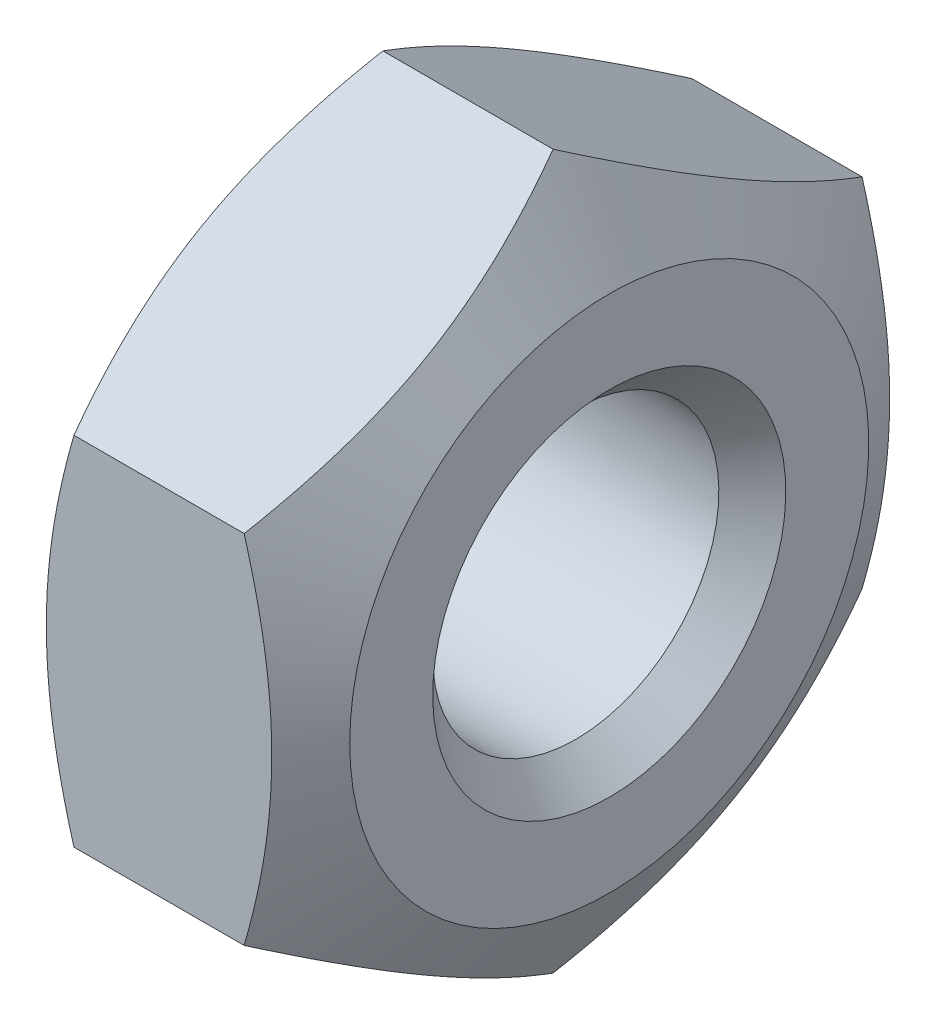
ISO-10303-21;
HEADER;
FILE_DESCRIPTION(('STEP AP214'),'2;1');
FILE_NAME('part.step','',(''),(''),'','','');
FILE_SCHEMA(('AUTOMOTIVE_DESIGN { 1 0 10303 214 1 1 1 1 }'));
ENDSEC;
DATA;
#1=APPLICATION_CONTEXT('core data for automotive mechanical design processes');
#2=APPLICATION_PROTOCOL_DEFINITION('international standard','automotive_design',2000,#1);
#3=PRODUCT_CONTEXT('',#1,'mechanical');
#4=PRODUCT('Part','Part','',(#3));
#5=PRODUCT_RELATED_PRODUCT_CATEGORY('part','',(#4));
#6=PRODUCT_DEFINITION_FORMATION('','',#4);
#7=PRODUCT_DEFINITION_CONTEXT('part definition',#1,'design');
#8=PRODUCT_DEFINITION('design','',#6,#7);
#9=PRODUCT_DEFINITION_SHAPE('','',#8);
#10=(LENGTH_UNIT() NAMED_UNIT(*) SI_UNIT(.MILLI.,.METRE.));
#11=(NAMED_UNIT(*) PLANE_ANGLE_UNIT() SI_UNIT($,.RADIAN.));
#12=(NAMED_UNIT(*) SI_UNIT($,.STERADIAN.) SOLID_ANGLE_UNIT());
#13=UNCERTAINTY_MEASURE_WITH_UNIT(LENGTH_MEASURE(1.E-05),#10,'distance_accuracy_value','');
#14=(GEOMETRIC_REPRESENTATION_CONTEXT(3) GLOBAL_UNCERTAINTY_ASSIGNED_CONTEXT((#13)) GLOBAL_UNIT_ASSIGNED_CONTEXT((#10,
#11,#12)) REPRESENTATION_CONTEXT('',''));
#15=CARTESIAN_POINT('',(0.,0.,0.));
#16=DIRECTION('',(0.,0.,1.));
#17=DIRECTION('',(1.,0.,0.));
#18=AXIS2_PLACEMENT_3D('',#15,#16,#17);
#19=CARTESIAN_POINT('',(1.6,0.,0.));
#20=DIRECTION('',(1.,0.,0.));
#21=DIRECTION('',(0.,0.,-1.));
#22=AXIS2_PLACEMENT_3D('',#19,#20,#21);
#23=PLANE('',#22);
#24=CARTESIAN_POINT('',(1.6,0.,0.));
#25=DIRECTION('',(-1.,0.,0.));
#26=DIRECTION('',(0.,-1.,0.));
#27=AXIS2_PLACEMENT_3D('',#24,#25,#26);
#28=CIRCLE('',#27,2.);
#29=CARTESIAN_POINT('',(1.60000000000001,-2.,0.));
#30=VERTEX_POINT('',#29);
#31=EDGE_CURVE('E209',#30,#30,#28,.T.);
#32=ORIENTED_EDGE('',*,*,#31,.T.);
#33=EDGE_LOOP('',(#32));
#34=FACE_BOUND('',#33,.T.);
#35=CARTESIAN_POINT('',(1.6,0.,0.));
#36=DIRECTION('',(-1.,0.,0.));
#37=DIRECTION('',(0.,0.,1.));
#38=AXIS2_PLACEMENT_3D('',#35,#36,#37);
#39=CIRCLE('',#38,2.94);
#40=CARTESIAN_POINT('',(1.6,0.,2.94));
#41=VERTEX_POINT('',#40);
#42=EDGE_CURVE('E229',#41,#41,#39,.T.);
#43=ORIENTED_EDGE('',*,*,#42,.F.);
#44=EDGE_LOOP('',(#43));
#45=FACE_BOUND('',#44,.T.);
#46=ADVANCED_FACE('F37',(#34,#45),#23,.T.);
#47=CARTESIAN_POINT('',(-1.6,0.,0.));
#48=DIRECTION('',(1.,0.,0.));
#49=DIRECTION('',(0.,0.,-1.));
#50=AXIS2_PLACEMENT_3D('',#47,#48,#49);
#51=PLANE('',#50);
#52=CARTESIAN_POINT('',(-1.6,0.,0.));
#53=DIRECTION('',(-1.,0.,0.));
#54=DIRECTION('',(0.,-1.,0.));
#55=AXIS2_PLACEMENT_3D('',#52,#53,#54);
#56=CIRCLE('',#55,2.00000000000001);
#57=CARTESIAN_POINT('',(-1.59999999999999,-2.00000000000001,0.));
#58=VERTEX_POINT('',#57);
#59=EDGE_CURVE('E114',#58,#58,#56,.T.);
#60=ORIENTED_EDGE('',*,*,#59,.F.);
#61=EDGE_LOOP('',(#60));
#62=FACE_BOUND('',#61,.T.);
#63=CARTESIAN_POINT('',(-1.6,0.,0.));
#64=DIRECTION('',(-1.,0.,0.));
#65=DIRECTION('',(0.,0.,1.));
#66=AXIS2_PLACEMENT_3D('',#63,#64,#65);
#67=CIRCLE('',#66,2.94);
#68=CARTESIAN_POINT('',(-1.6,0.,2.94));
#69=VERTEX_POINT('',#68);
#70=EDGE_CURVE('E97',#69,#69,#67,.T.);
#71=ORIENTED_EDGE('',*,*,#70,.T.);
#72=EDGE_LOOP('',(#71));
#73=FACE_BOUND('',#72,.T.);
#74=ADVANCED_FACE('F223',(#62,#73),#51,.F.);
#75=CARTESIAN_POINT('',(-1.221,0.,0.));
#76=DIRECTION('',(-1.,0.,0.));
#77=DIRECTION('',(0.,-1.,0.));
#78=AXIS2_PLACEMENT_3D('',#75,#76,#77);
#79=CONICAL_SURFACE('',#78,1.62100000000001,0.78539816339745);
#80=ORIENTED_EDGE('',*,*,#59,.T.);
#81=EDGE_LOOP('',(#80));
#82=FACE_BOUND('',#81,.T.);
#83=CARTESIAN_POINT('',(-1.221,0.,0.));
#84=DIRECTION('',(-1.,0.,0.));
#85=DIRECTION('',(0.,-1.,0.));
#86=AXIS2_PLACEMENT_3D('',#83,#84,#85);
#87=CIRCLE('',#86,1.62100000000001);
#88=CARTESIAN_POINT('',(-1.22099999999999,-1.62100000000001,0.));
#89=VERTEX_POINT('',#88);
#90=EDGE_CURVE('E215',#89,#89,#87,.T.);
#91=ORIENTED_EDGE('',*,*,#90,.F.);
#92=EDGE_LOOP('',(#91));
#93=FACE_BOUND('',#92,.T.);
#94=ADVANCED_FACE('F220',(#82,#93),#79,.F.);
#95=CARTESIAN_POINT('',(1.6,0.,0.));
#96=DIRECTION('',(-1.,0.,0.));
#97=DIRECTION('',(0.,-1.,0.));
#98=AXIS2_PLACEMENT_3D('',#95,#96,#97);
#99=CYLINDRICAL_SURFACE('',#98,1.621);
#100=ORIENTED_EDGE('',*,*,#90,.T.);
#101=EDGE_LOOP('',(#100));
#102=FACE_BOUND('',#101,.T.);
#103=CARTESIAN_POINT('',(1.221,0.,0.));
#104=DIRECTION('',(-1.,0.,0.));
#105=DIRECTION('',(0.,-1.,0.));
#106=AXIS2_PLACEMENT_3D('',#103,#104,#105);
#107=CIRCLE('',#106,1.621);
#108=CARTESIAN_POINT('',(1.22100000000001,-1.621,0.));
#109=VERTEX_POINT('',#108);
#110=EDGE_CURVE('E212',#109,#109,#107,.T.);
#111=ORIENTED_EDGE('',*,*,#110,.F.);
#112=EDGE_LOOP('',(#111));
#113=FACE_BOUND('',#112,.T.);
#114=ADVANCED_FACE('F287',(#102,#113),#99,.F.);
#115=CARTESIAN_POINT('',(1.6,0.,0.));
#116=DIRECTION('',(1.,0.,0.));
#117=DIRECTION('',(0.,1.,0.));
#118=AXIS2_PLACEMENT_3D('',#115,#116,#117);
#119=CONICAL_SURFACE('',#118,2.,0.785398163397446);
#120=ORIENTED_EDGE('',*,*,#110,.T.);
#121=EDGE_LOOP('',(#120));
#122=FACE_BOUND('',#121,.T.);
#123=ORIENTED_EDGE('',*,*,#31,.F.);
#124=EDGE_LOOP('',(#123));
#125=FACE_BOUND('',#124,.T.);
#126=ADVANCED_FACE('F157',(#122,#125),#119,.F.);
#127=CARTESIAN_POINT('',(-1.6,0.,0.));
#128=DIRECTION('',(1.,0.,0.));
#129=DIRECTION('',(0.,0.,-1.));
#130=AXIS2_PLACEMENT_3D('',#127,#128,#129);
#131=CONICAL_SURFACE('',#130,2.94,1.0471975511966);
#132=ORIENTED_EDGE('',*,*,#70,.F.);
#133=EDGE_LOOP('',(#132));
#134=FACE_BOUND('',#133,.T.);
#135=CARTESIAN_POINT('',(0.441474954061103,-5.44864913716397,3.5));
#136=CARTESIAN_POINT('',(0.36714387082903,-5.29558885287692,3.5));
#137=CARTESIAN_POINT('',(0.293519596731415,-5.14217939112153,3.5));
#138=CARTESIAN_POINT('',(0.148081835601638,-4.83447646901114,3.5));
#139=CARTESIAN_POINT('',(0.0762686300636663,-4.68018287575388,3.5));
#140=CARTESIAN_POINT('',(-0.0655065911484501,-4.36974119532895,3.5));
#141=CARTESIAN_POINT('',(-0.135456582519247,-4.21358759793745,3.5));
#142=CARTESIAN_POINT('',(-0.272521017680301,-3.90004544494031,3.5));
#143=CARTESIAN_POINT('',(-0.339635594150233,-3.74265694752981,3.5));
#144=CARTESIAN_POINT('',(-0.472397805685798,-3.4212708463241,3.5));
#145=CARTESIAN_POINT('',(-0.53792754319367,-3.25722427485915,3.5));
#146=CARTESIAN_POINT('',(-0.664077480398305,-2.92721964622151,3.5));
#147=CARTESIAN_POINT('',(-0.724697132180678,-2.76126137807711,3.5));
#148=CARTESIAN_POINT('',(-0.839450987940789,-2.42747316596201,3.5));
#149=CARTESIAN_POINT('',(-0.893598133705832,-2.25964771605664,3.5));
#150=CARTESIAN_POINT('',(-0.993683325463214,-1.92158960885633,3.5));
#151=CARTESIAN_POINT('',(-1.03962393433025,-1.7513577210691,3.5));
#152=CARTESIAN_POINT('',(-1.12086416788138,-1.40932070704756,3.5));
#153=CARTESIAN_POINT('',(-1.15622114877958,-1.23752945819171,3.5));
#154=CARTESIAN_POINT('',(-1.21430369830842,-0.891789227822158,3.5));
#155=CARTESIAN_POINT('',(-1.23703053199849,-0.717840464194118,3.5));
#156=CARTESIAN_POINT('',(-1.26774311205491,-0.370935687489344,3.5));
#157=CARTESIAN_POINT('',(-1.27592008055338,-0.197997031910499,3.5));
#158=CARTESIAN_POINT('',(-1.27734435865141,0.147957686761888,3.5));
#159=CARTESIAN_POINT('',(-1.27059133883581,0.320973751479174,3.5));
#160=CARTESIAN_POINT('',(-1.24698570887598,0.61405757957757,3.5));
#161=CARTESIAN_POINT('',(-1.23377123521343,0.734436634883864,3.5));
#162=CARTESIAN_POINT('',(-1.20092589524453,0.97432211172445,3.5));
#163=CARTESIAN_POINT('',(-1.18129417616977,1.09382841512239,3.5));
#164=CARTESIAN_POINT('',(-1.11380411111662,1.45087169876695,3.5));
#165=CARTESIAN_POINT('',(-1.05736256830244,1.68680478770581,3.5));
#166=CARTESIAN_POINT('',(-0.959367115484278,2.03968158072677,3.5));
#167=CARTESIAN_POINT('',(-0.92400944378153,2.15845014886247,3.5));
#168=CARTESIAN_POINT('',(-0.84959344418595,2.39483341981169,3.5));
#169=CARTESIAN_POINT('',(-0.81053508992762,2.51244811439784,3.5));
#170=CARTESIAN_POINT('',(-0.729346992550235,2.7465612440407,3.5));
#171=CARTESIAN_POINT('',(-0.687218221531893,2.86306001929715,3.5));
#172=CARTESIAN_POINT('',(-0.600387850358036,3.09508950494694,3.5));
#173=CARTESIAN_POINT('',(-0.555686294484067,3.21062023196268,3.5));
#174=CARTESIAN_POINT('',(-0.439165206742981,3.50362028318104,3.5));
#175=CARTESIAN_POINT('',(-0.365855481890876,3.680496207311,3.5));
#176=CARTESIAN_POINT('',(-0.215324958278967,4.03258146709879,3.5));
#177=CARTESIAN_POINT('',(-0.138103829657286,4.20779066071065,3.5));
#178=CARTESIAN_POINT('',(0.0193838487065479,4.55688835011644,3.5));
#179=CARTESIAN_POINT('',(0.0996512223042437,4.73077647314543,3.5));
#180=CARTESIAN_POINT('',(0.262565043241074,5.07743658455577,3.5));
#181=CARTESIAN_POINT('',(0.345211552152673,5.25020854390867,3.5));
#182=CARTESIAN_POINT('',(0.596178500438457,5.76761251456872,3.5));
#183=CARTESIAN_POINT('',(0.767317110687246,6.11087620335342,3.5));
#184=CARTESIAN_POINT('',(1.11445362222391,6.79484927851294,3.5));
#185=CARTESIAN_POINT('',(1.29045072850529,7.1355590713213,3.5));
#186=CARTESIAN_POINT('',(1.62887230795716,7.78278291979732,3.5));
#187=CARTESIAN_POINT('',(1.79098952535944,8.08945792143392,3.5));
#188=CARTESIAN_POINT('',(2.11727165583695,8.7017337160243,3.5));
#189=CARTESIAN_POINT('',(2.28143666658556,9.00733445684118,3.5));
#190=CARTESIAN_POINT('',(2.61082295735372,9.61681561726988,3.5));
#191=CARTESIAN_POINT('',(2.7760397684611,9.92069845501199,3.5));
#192=CARTESIAN_POINT('',(3.10766362389957,10.5277882118101,3.5));
#193=CARTESIAN_POINT('',(3.27407058890743,10.8309951741783,3.5));
#194=CARTESIAN_POINT('',(3.44091484193445,11.1339596098294,3.5));
#195=B_SPLINE_CURVE_WITH_KNOTS('',3,(#135,#136,#137,#138,#139,#140,#141,#142,#143,#144,#145,
#146,#147,#148,#149,#150,#151,#152,#153,#154,#155,#156,#157,#158,#159,#160,#161,#162,#163,#164,
#165,#166,#167,#168,#169,#170,#171,#172,#173,#174,#175,#176,#177,#178,#179,#180,#181,#182,#183,
#184,#185,#186,#187,#188,#189,#190,#191,#192,#193,#194),.UNSPECIFIED.,.F.,.F.,(4,2,2,2,2,2,2,2,
2,2,2,2,2,2,2,2,2,2,2,2,2,2,2,2,2,2,2,2,2,4),(0.,0.510469699834298,1.02101825892915,
1.53431090548053,2.04757950648441,2.57747045969766,3.10742046198849,3.63629244578976,
4.16499897474103,4.69078611444423,5.21652058081703,5.73529305509796,6.25407697568537,
6.61720784520961,6.98038698973291,7.70712991805825,8.07885757960869,8.45058788973047,
8.82220101623566,9.19380774862447,9.7681398505382,10.3425204687214,10.9170575506276,
11.4916095150519,12.6422193539049,13.7926420190676,14.8332967038584,15.8740012158949,
16.9116746902328,17.9492796369063),.UNSPECIFIED.);
#196=CARTESIAN_POINT('',(-0.964076458084161,-2.0207259421637,3.5));
#197=VERTEX_POINT('',#196);
#198=CARTESIAN_POINT('',(-0.964076458084161,2.0207259421637,3.5));
#199=VERTEX_POINT('',#198);
#200=EDGE_CURVE('E53',#197,#199,#195,.T.);
#201=ORIENTED_EDGE('',*,*,#200,.T.);
#202=CARTESIAN_POINT('',(-0.964009788560433,2.02061047210986,3.5002));
#203=CARTESIAN_POINT('',(-1.01529806026382,2.10941108799268,3.34639282154755));
#204=CARTESIAN_POINT('',(-1.06194289543761,2.1989782252291,3.19125798916558));
#205=CARTESIAN_POINT('',(-1.14336197372045,2.37966345361546,2.87830199342322));
#206=CARTESIAN_POINT('',(-1.17810741366924,2.47078475532383,2.7204752692125));
#207=CARTESIAN_POINT('',(-1.23219382207097,2.65189807961075,2.40677778961987));
#208=CARTESIAN_POINT('',(-1.25189476299342,2.741862235454,2.25095530083931));
#209=CARTESIAN_POINT('',(-1.27541371651655,2.92221386641057,1.93857711279463));
#210=CARTESIAN_POINT('',(-1.27925120470823,3.01260068598003,1.78202254896577));
#211=CARTESIAN_POINT('',(-1.27126854737682,3.18149398149331,1.48949078007901));
#212=CARTESIAN_POINT('',(-1.26140841518419,3.26002573814994,1.35346978754209));
#213=CARTESIAN_POINT('',(-1.23015738235439,3.41657761679355,1.082313979711));
#214=CARTESIAN_POINT('',(-1.208755805968,3.49459719728459,0.947180102315316));
#215=CARTESIAN_POINT('',(-1.15525344137322,3.6514718648943,0.675465207594816));
#216=CARTESIAN_POINT('',(-1.12292585480871,3.73030709667645,0.538918580721664));
#217=CARTESIAN_POINT('',(-1.0495549154458,3.88680174018326,0.267861907055498));
#218=CARTESIAN_POINT('',(-1.00852880268393,3.96446315689011,0.133348387531464));
#219=CARTESIAN_POINT('',(-0.964009788560425,4.04156735438124,-0.000199999999999919));
#220=B_SPLINE_CURVE_WITH_KNOTS('',3,(#202,#203,#204,#205,#206,#207,#208,#209,#210,#211,#212,
#213,#214,#215,#216,#217,#218,#219),.UNSPECIFIED.,.F.,.F.,(4,2,2,2,2,2,2,2,4),(0.,
0.554793832886254,1.11092123814984,1.65328467083219,2.19498204478403,2.6666513085086,
3.13875761298268,3.6213361260051,4.10296698719188),.UNSPECIFIED.);
#221=CARTESIAN_POINT('',(-0.964076458084152,4.0414518843274,0.));
#222=VERTEX_POINT('',#221);
#223=EDGE_CURVE('E88',#199,#222,#220,.T.);
#224=ORIENTED_EDGE('',*,*,#223,.T.);
#225=CARTESIAN_POINT('',(-0.964009788560425,4.04156735438124,0.0002));
#226=CARTESIAN_POINT('',(-1.01529806026381,3.95276673849842,-0.15360717845245));
#227=CARTESIAN_POINT('',(-1.0619428954376,3.863199601262,-0.308742010834425));
#228=CARTESIAN_POINT('',(-1.14336197372045,3.68251437287564,-0.621698006576783));
#229=CARTESIAN_POINT('',(-1.17810741366924,3.59139307116727,-0.779524730787499));
#230=CARTESIAN_POINT('',(-1.23219382207096,3.41027974688035,-1.09322221038013));
#231=CARTESIAN_POINT('',(-1.25189476299342,3.32031559103709,-1.2490446991607));
#232=CARTESIAN_POINT('',(-1.27541371651655,3.13996396008053,-1.56142288720538));
#233=CARTESIAN_POINT('',(-1.27925120470823,3.04957714051107,-1.71797745103424));
#234=CARTESIAN_POINT('',(-1.27126854737682,2.88068384499778,-2.010509219921));
#235=CARTESIAN_POINT('',(-1.26140841518419,2.80215208834115,-2.14653021245791));
#236=CARTESIAN_POINT('',(-1.2301573823544,2.64560020969754,-2.417686020289));
#237=CARTESIAN_POINT('',(-1.208755805968,2.56758062920651,-2.55281989768469));
#238=CARTESIAN_POINT('',(-1.15525344137322,2.41070596159679,-2.82453479240519));
#239=CARTESIAN_POINT('',(-1.12292585480872,2.33187072981464,-2.96108141927834));
#240=CARTESIAN_POINT('',(-1.04955491544581,2.17537608630784,-3.2321380929445));
#241=CARTESIAN_POINT('',(-1.00852880268394,2.09771466960099,-3.36665161246854));
#242=CARTESIAN_POINT('',(-0.964009788560433,2.02061047210986,-3.5002));
#243=B_SPLINE_CURVE_WITH_KNOTS('',3,(#225,#226,#227,#228,#229,#230,#231,#232,#233,#234,#235,
#236,#237,#238,#239,#240,#241,#242),.UNSPECIFIED.,.F.,.F.,(4,2,2,2,2,2,2,2,4),(0.,
0.554793832886256,1.11092123814984,1.65328467083219,2.19498204478404,2.66665130850861,
3.13875761298268,3.6213361260051,4.10296698719188),.UNSPECIFIED.);
#244=CARTESIAN_POINT('',(-0.964076458084161,2.0207259421637,-3.5));
#245=VERTEX_POINT('',#244);
#246=EDGE_CURVE('E91',#222,#245,#243,.T.);
#247=ORIENTED_EDGE('',*,*,#246,.T.);
#248=CARTESIAN_POINT('',(0.441474954061103,-5.44864913716397,-3.5));
#249=CARTESIAN_POINT('',(0.36714387082903,-5.29558885287692,-3.5));
#250=CARTESIAN_POINT('',(0.293519596731415,-5.14217939112153,-3.5));
#251=CARTESIAN_POINT('',(0.148081835601638,-4.83447646901114,-3.5));
#252=CARTESIAN_POINT('',(0.0762686300636663,-4.68018287575388,-3.5));
#253=CARTESIAN_POINT('',(-0.0655065911484501,-4.36974119532895,-3.5));
#254=CARTESIAN_POINT('',(-0.135456582519247,-4.21358759793745,-3.5));
#255=CARTESIAN_POINT('',(-0.272521017680301,-3.90004544494031,-3.5));
#256=CARTESIAN_POINT('',(-0.339635594150233,-3.74265694752981,-3.5));
#257=CARTESIAN_POINT('',(-0.472397805685798,-3.4212708463241,-3.5));
#258=CARTESIAN_POINT('',(-0.53792754319367,-3.25722427485915,-3.5));
#259=CARTESIAN_POINT('',(-0.664077480398305,-2.92721964622151,-3.5));
#260=CARTESIAN_POINT('',(-0.724697132180678,-2.76126137807711,-3.5));
#261=CARTESIAN_POINT('',(-0.839450987940789,-2.42747316596201,-3.5));
#262=CARTESIAN_POINT('',(-0.893598133705832,-2.25964771605664,-3.5));
#263=CARTESIAN_POINT('',(-0.993683325463214,-1.92158960885633,-3.5));
#264=CARTESIAN_POINT('',(-1.03962393433025,-1.7513577210691,-3.5));
#265=CARTESIAN_POINT('',(-1.12086416788138,-1.40932070704756,-3.5));
#266=CARTESIAN_POINT('',(-1.15622114877958,-1.23752945819171,-3.5));
#267=CARTESIAN_POINT('',(-1.21430369830842,-0.891789227822158,-3.5));
#268=CARTESIAN_POINT('',(-1.23703053199849,-0.717840464194118,-3.5));
#269=CARTESIAN_POINT('',(-1.26774311205491,-0.370935687489344,-3.5));
#270=CARTESIAN_POINT('',(-1.27592008055338,-0.197997031910499,-3.5));
#271=CARTESIAN_POINT('',(-1.27734435865141,0.147957686761888,-3.5));
#272=CARTESIAN_POINT('',(-1.27059133883581,0.320973751479174,-3.5));
#273=CARTESIAN_POINT('',(-1.24698570887598,0.61405757957757,-3.5));
#274=CARTESIAN_POINT('',(-1.23377123521343,0.734436634883864,-3.5));
#275=CARTESIAN_POINT('',(-1.20092589524453,0.97432211172445,-3.5));
#276=CARTESIAN_POINT('',(-1.18129417616977,1.09382841512239,-3.5));
#277=CARTESIAN_POINT('',(-1.11380411111662,1.45087169876695,-3.5));
#278=CARTESIAN_POINT('',(-1.05736256830244,1.68680478770581,-3.5));
#279=CARTESIAN_POINT('',(-0.959367115484278,2.03968158072677,-3.5));
#280=CARTESIAN_POINT('',(-0.92400944378153,2.15845014886247,-3.5));
#281=CARTESIAN_POINT('',(-0.84959344418595,2.39483341981169,-3.5));
#282=CARTESIAN_POINT('',(-0.81053508992762,2.51244811439784,-3.5));
#283=CARTESIAN_POINT('',(-0.729346992550235,2.7465612440407,-3.5));
#284=CARTESIAN_POINT('',(-0.687218221531893,2.86306001929715,-3.5));
#285=CARTESIAN_POINT('',(-0.600387850358036,3.09508950494694,-3.5));
#286=CARTESIAN_POINT('',(-0.555686294484067,3.21062023196268,-3.5));
#287=CARTESIAN_POINT('',(-0.439165206742981,3.50362028318104,-3.5));
#288=CARTESIAN_POINT('',(-0.365855481890876,3.680496207311,-3.5));
#289=CARTESIAN_POINT('',(-0.215324958278967,4.03258146709879,-3.5));
#290=CARTESIAN_POINT('',(-0.138103829657286,4.20779066071065,-3.5));
#291=CARTESIAN_POINT('',(0.0193838487065479,4.55688835011644,-3.5));
#292=CARTESIAN_POINT('',(0.0996512223042437,4.73077647314543,-3.5));
#293=CARTESIAN_POINT('',(0.262565043241074,5.07743658455577,-3.5));
#294=CARTESIAN_POINT('',(0.345211552152673,5.25020854390867,-3.5));
#295=CARTESIAN_POINT('',(0.596178500438457,5.76761251456872,-3.5));
#296=CARTESIAN_POINT('',(0.767317110687246,6.11087620335342,-3.5));
#297=CARTESIAN_POINT('',(1.11445362222391,6.79484927851294,-3.5));
#298=CARTESIAN_POINT('',(1.29045072850529,7.1355590713213,-3.5));
#299=CARTESIAN_POINT('',(1.62887230795716,7.78278291979732,-3.5));
#300=CARTESIAN_POINT('',(1.79098952535944,8.08945792143392,-3.5));
#301=CARTESIAN_POINT('',(2.11727165583695,8.7017337160243,-3.5));
#302=CARTESIAN_POINT('',(2.28143666658556,9.00733445684118,-3.5));
#303=CARTESIAN_POINT('',(2.61082295735372,9.61681561726988,-3.5));
#304=CARTESIAN_POINT('',(2.7760397684611,9.92069845501199,-3.5));
#305=CARTESIAN_POINT('',(3.10766362389957,10.5277882118101,-3.5));
#306=CARTESIAN_POINT('',(3.27407058890743,10.8309951741783,-3.5));
#307=CARTESIAN_POINT('',(3.44091484193445,11.1339596098294,-3.5));
#308=B_SPLINE_CURVE_WITH_KNOTS('',3,(#248,#249,#250,#251,#252,#253,#254,#255,#256,#257,#258,
#259,#260,#261,#262,#263,#264,#265,#266,#267,#268,#269,#270,#271,#272,#273,#274,#275,#276,#277,
#278,#279,#280,#281,#282,#283,#284,#285,#286,#287,#288,#289,#290,#291,#292,#293,#294,#295,#296,
#297,#298,#299,#300,#301,#302,#303,#304,#305,#306,#307),.UNSPECIFIED.,.F.,.F.,(4,2,2,2,2,2,2,2,
2,2,2,2,2,2,2,2,2,2,2,2,2,2,2,2,2,2,2,2,2,4),(0.,0.510469699834298,1.02101825892915,
1.53431090548053,2.04757950648441,2.57747045969766,3.10742046198849,3.63629244578976,
4.16499897474103,4.69078611444423,5.21652058081703,5.73529305509796,6.25407697568537,
6.61720784520961,6.98038698973291,7.70712991805825,8.07885757960869,8.45058788973047,
8.82220101623566,9.19380774862447,9.7681398505382,10.3425204687214,10.9170575506276,
11.4916095150519,12.6422193539049,13.7926420190676,14.8332967038584,15.8740012158949,
16.9116746902328,17.9492796369063),.UNSPECIFIED.);
#309=CARTESIAN_POINT('',(-0.964076458084437,-2.02072594216411,-3.5));
#310=VERTEX_POINT('',#309);
#311=EDGE_CURVE('E106',#245,#310,#308,.F.);
#312=ORIENTED_EDGE('',*,*,#311,.T.);
#313=CARTESIAN_POINT('',(-0.964009788560433,-2.02061047210986,-3.5002));
#314=CARTESIAN_POINT('',(-1.01529806026382,-2.10941108799268,-3.34639282154755));
#315=CARTESIAN_POINT('',(-1.06194289543761,-2.1989782252291,-3.19125798916558));
#316=CARTESIAN_POINT('',(-1.14336197372045,-2.37966345361546,-2.87830199342322));
#317=CARTESIAN_POINT('',(-1.17810741366924,-2.47078475532383,-2.7204752692125));
#318=CARTESIAN_POINT('',(-1.23219382207097,-2.65189807961075,-2.40677778961987));
#319=CARTESIAN_POINT('',(-1.25189476299342,-2.741862235454,-2.25095530083931));
#320=CARTESIAN_POINT('',(-1.27541371651655,-2.92221386641057,-1.93857711279463));
#321=CARTESIAN_POINT('',(-1.27925120470823,-3.01260068598003,-1.78202254896577));
#322=CARTESIAN_POINT('',(-1.27126854737682,-3.18149398149331,-1.48949078007901));
#323=CARTESIAN_POINT('',(-1.26140841518419,-3.26002573814994,-1.35346978754209));
#324=CARTESIAN_POINT('',(-1.23015738235439,-3.41657761679355,-1.082313979711));
#325=CARTESIAN_POINT('',(-1.208755805968,-3.49459719728459,-0.947180102315316));
#326=CARTESIAN_POINT('',(-1.15525344137322,-3.6514718648943,-0.675465207594816));
#327=CARTESIAN_POINT('',(-1.12292585480871,-3.73030709667645,-0.538918580721664));
#328=CARTESIAN_POINT('',(-1.0495549154458,-3.88680174018326,-0.267861907055498));
#329=CARTESIAN_POINT('',(-1.00852880268393,-3.96446315689011,-0.133348387531464));
#330=CARTESIAN_POINT('',(-0.964009788560425,-4.04156735438124,0.000199999999999919));
#331=B_SPLINE_CURVE_WITH_KNOTS('',3,(#313,#314,#315,#316,#317,#318,#319,#320,#321,#322,#323,
#324,#325,#326,#327,#328,#329,#330),.UNSPECIFIED.,.F.,.F.,(4,2,2,2,2,2,2,2,4),(0.,
0.554793832886254,1.11092123814984,1.65328467083219,2.19498204478403,2.6666513085086,
3.13875761298268,3.6213361260051,4.10296698719188),.UNSPECIFIED.);
#332=CARTESIAN_POINT('',(-0.964076458084152,-4.0414518843274,0.));
#333=VERTEX_POINT('',#332);
#334=EDGE_CURVE('E126',#310,#333,#331,.T.);
#335=ORIENTED_EDGE('',*,*,#334,.T.);
#336=CARTESIAN_POINT('',(-0.964009788560425,-4.04156735438124,-0.0002));
#337=CARTESIAN_POINT('',(-1.01529806026381,-3.95276673849842,0.15360717845245));
#338=CARTESIAN_POINT('',(-1.0619428954376,-3.863199601262,0.308742010834425));
#339=CARTESIAN_POINT('',(-1.14336197372045,-3.68251437287564,0.621698006576783));
#340=CARTESIAN_POINT('',(-1.17810741366924,-3.59139307116727,0.779524730787499));
#341=CARTESIAN_POINT('',(-1.23219382207096,-3.41027974688035,1.09322221038013));
#342=CARTESIAN_POINT('',(-1.25189476299342,-3.32031559103709,1.2490446991607));
#343=CARTESIAN_POINT('',(-1.27541371651655,-3.13996396008053,1.56142288720538));
#344=CARTESIAN_POINT('',(-1.27925120470823,-3.04957714051107,1.71797745103424));
#345=CARTESIAN_POINT('',(-1.27126854737682,-2.88068384499778,2.010509219921));
#346=CARTESIAN_POINT('',(-1.26140841518419,-2.80215208834115,2.14653021245791));
#347=CARTESIAN_POINT('',(-1.2301573823544,-2.64560020969754,2.417686020289));
#348=CARTESIAN_POINT('',(-1.208755805968,-2.56758062920651,2.55281989768469));
#349=CARTESIAN_POINT('',(-1.15525344137322,-2.41070596159679,2.82453479240519));
#350=CARTESIAN_POINT('',(-1.12292585480872,-2.33187072981464,2.96108141927834));
#351=CARTESIAN_POINT('',(-1.04955491544581,-2.17537608630784,3.2321380929445));
#352=CARTESIAN_POINT('',(-1.00852880268394,-2.09771466960099,3.36665161246854));
#353=CARTESIAN_POINT('',(-0.964009788560433,-2.02061047210986,3.5002));
#354=B_SPLINE_CURVE_WITH_KNOTS('',3,(#336,#337,#338,#339,#340,#341,#342,#343,#344,#345,#346,
#347,#348,#349,#350,#351,#352,#353),.UNSPECIFIED.,.F.,.F.,(4,2,2,2,2,2,2,2,4),(0.,
0.554793832886256,1.11092123814984,1.65328467083219,2.19498204478404,2.66665130850861,
3.13875761298268,3.6213361260051,4.10296698719188),.UNSPECIFIED.);
#355=EDGE_CURVE('E134',#333,#197,#354,.T.);
#356=ORIENTED_EDGE('',*,*,#355,.T.);
#357=EDGE_LOOP('',(#201,#224,#247,#312,#335,#356));
#358=FACE_BOUND('',#357,.T.);
#359=ADVANCED_FACE('F90',(#134,#358),#131,.T.);
#360=CARTESIAN_POINT('',(0.,0.,0.));
#361=DIRECTION('',(-1.,0.,0.));
#362=DIRECTION('',(0.,0.,1.));
#363=AXIS2_PLACEMENT_3D('',#360,#361,#362);
#364=CONICAL_SURFACE('',#363,5.7112812921102,1.0471975511966);
#365=ORIENTED_EDGE('',*,*,#42,.T.);
#366=EDGE_LOOP('',(#365));
#367=FACE_BOUND('',#366,.T.);
#368=CARTESIAN_POINT('',(-0.441474954061102,-5.44864913716397,3.5));
#369=CARTESIAN_POINT('',(-0.36714387082903,-5.29558885287692,3.5));
#370=CARTESIAN_POINT('',(-0.293519596731414,-5.14217939112153,3.5));
#371=CARTESIAN_POINT('',(-0.148081835601637,-4.83447646901114,3.5));
#372=CARTESIAN_POINT('',(-0.0762686300636661,-4.68018287575388,3.5));
#373=CARTESIAN_POINT('',(0.0655065911484504,-4.36974119532895,3.5));
#374=CARTESIAN_POINT('',(0.135456582519247,-4.21358759793746,3.5));
#375=CARTESIAN_POINT('',(0.272521017680301,-3.90004544494031,3.5));
#376=CARTESIAN_POINT('',(0.339635594150232,-3.74265694752981,3.5));
#377=CARTESIAN_POINT('',(0.472397805685797,-3.42127084632411,3.5));
#378=CARTESIAN_POINT('',(0.53792754319367,-3.25722427485915,3.5));
#379=CARTESIAN_POINT('',(0.664077480398305,-2.92721964622151,3.5));
#380=CARTESIAN_POINT('',(0.724697132180678,-2.76126137807712,3.5));
#381=CARTESIAN_POINT('',(0.839450987940789,-2.42747316596201,3.5));
#382=CARTESIAN_POINT('',(0.893598133705832,-2.25964771605664,3.5));
#383=CARTESIAN_POINT('',(0.993683325463214,-1.92158960885633,3.5));
#384=CARTESIAN_POINT('',(1.03962393433025,-1.7513577210691,3.5));
#385=CARTESIAN_POINT('',(1.12086416788138,-1.40932070704756,3.5));
#386=CARTESIAN_POINT('',(1.15622114877958,-1.23752945819171,3.5));
#387=CARTESIAN_POINT('',(1.21430369830842,-0.891789227822158,3.5));
#388=CARTESIAN_POINT('',(1.23703053199849,-0.717840464194118,3.5));
#389=CARTESIAN_POINT('',(1.26774311205491,-0.370935687489343,3.5));
#390=CARTESIAN_POINT('',(1.27592008055338,-0.197997031910498,3.5));
#391=CARTESIAN_POINT('',(1.27734435865141,0.147957686761888,3.5));
#392=CARTESIAN_POINT('',(1.27059133883581,0.320973751479174,3.5));
#393=CARTESIAN_POINT('',(1.24698570887598,0.61405757957757,3.5));
#394=CARTESIAN_POINT('',(1.23377123521343,0.734436634883864,3.5));
#395=CARTESIAN_POINT('',(1.20092589524453,0.97432211172445,3.5));
#396=CARTESIAN_POINT('',(1.18129417616977,1.09382841512239,3.5));
#397=CARTESIAN_POINT('',(1.11380411111662,1.45087169876695,3.5));
#398=CARTESIAN_POINT('',(1.05736256830244,1.68680478770581,3.5));
#399=CARTESIAN_POINT('',(0.959367115484279,2.03968158072677,3.5));
#400=CARTESIAN_POINT('',(0.92400944378153,2.15845014886247,3.5));
#401=CARTESIAN_POINT('',(0.84959344418595,2.39483341981168,3.5));
#402=CARTESIAN_POINT('',(0.810535089927621,2.51244811439784,3.5));
#403=CARTESIAN_POINT('',(0.729346992550235,2.7465612440407,3.5));
#404=CARTESIAN_POINT('',(0.687218221531894,2.86306001929715,3.5));
#405=CARTESIAN_POINT('',(0.600387850358037,3.09508950494694,3.5));
#406=CARTESIAN_POINT('',(0.555686294484068,3.21062023196268,3.5));
#407=CARTESIAN_POINT('',(0.439165206742982,3.50362028318104,3.5));
#408=CARTESIAN_POINT('',(0.365855481890876,3.680496207311,3.5));
#409=CARTESIAN_POINT('',(0.215324958278967,4.03258146709878,3.5));
#410=CARTESIAN_POINT('',(0.138103829657287,4.20779066071065,3.5));
#411=CARTESIAN_POINT('',(-0.0193838487065468,4.55688835011644,3.5));
#412=CARTESIAN_POINT('',(-0.0996512223042429,4.73077647314543,3.5));
#413=CARTESIAN_POINT('',(-0.262565043241073,5.07743658455577,3.5));
#414=CARTESIAN_POINT('',(-0.345211552152672,5.25020854390866,3.5));
#415=CARTESIAN_POINT('',(-0.596178500438455,5.76761251456871,3.5));
#416=CARTESIAN_POINT('',(-0.767317110687244,6.11087620335342,3.5));
#417=CARTESIAN_POINT('',(-1.11445362222391,6.79484927851293,3.5));
#418=CARTESIAN_POINT('',(-1.29045072850529,7.1355590713213,3.5));
#419=CARTESIAN_POINT('',(-1.62887230795716,7.78278291979732,3.5));
#420=CARTESIAN_POINT('',(-1.79098952535944,8.08945792143392,3.5));
#421=CARTESIAN_POINT('',(-2.11727165583695,8.7017337160243,3.5));
#422=CARTESIAN_POINT('',(-2.28143666658556,9.00733445684118,3.5));
#423=CARTESIAN_POINT('',(-2.61082295735372,9.61681561726988,3.5));
#424=CARTESIAN_POINT('',(-2.7760397684611,9.92069845501199,3.5));
#425=CARTESIAN_POINT('',(-3.10766362389957,10.5277882118101,3.5));
#426=CARTESIAN_POINT('',(-3.27407058890743,10.8309951741783,3.5));
#427=CARTESIAN_POINT('',(-3.44091484193445,11.1339596098294,3.5));
#428=B_SPLINE_CURVE_WITH_KNOTS('',3,(#368,#369,#370,#371,#372,#373,#374,#375,#376,#377,#378,
#379,#380,#381,#382,#383,#384,#385,#386,#387,#388,#389,#390,#391,#392,#393,#394,#395,#396,#397,
#398,#399,#400,#401,#402,#403,#404,#405,#406,#407,#408,#409,#410,#411,#412,#413,#414,#415,#416,
#417,#418,#419,#420,#421,#422,#423,#424,#425,#426,#427),.UNSPECIFIED.,.F.,.F.,(4,2,2,2,2,2,2,2,
2,2,2,2,2,2,2,2,2,2,2,2,2,2,2,2,2,2,2,2,2,4),(0.,0.510469699834298,1.02101825892915,
1.53431090548053,2.04757950648441,2.57747045969766,3.10742046198849,3.63629244578976,
4.16499897474103,4.69078611444423,5.21652058081703,5.73529305509796,6.25407697568537,
6.6172078452096,6.98038698973291,7.70712991805825,8.07885757960869,8.45058788973047,
8.82220101623566,9.19380774862446,9.7681398505382,10.3425204687214,10.9170575506276,
11.4916095150519,12.6422193539049,13.7926420190676,14.8332967038584,15.8740012158949,
16.9116746902328,17.9492796369063),.UNSPECIFIED.);
#429=CARTESIAN_POINT('',(0.964076458084161,2.0207259421637,3.5));
#430=VERTEX_POINT('',#429);
#431=CARTESIAN_POINT('',(0.964076458084161,-2.0207259421637,3.5));
#432=VERTEX_POINT('',#431);
#433=EDGE_CURVE('E204',#430,#432,#428,.F.);
#434=ORIENTED_EDGE('',*,*,#433,.T.);
#435=CARTESIAN_POINT('',(0.964009788560433,-2.02061047210986,3.5002));
#436=CARTESIAN_POINT('',(1.01529806026382,-2.10941108799268,3.34639282154755));
#437=CARTESIAN_POINT('',(1.06194289543761,-2.1989782252291,3.19125798916558));
#438=CARTESIAN_POINT('',(1.14336197372045,-2.37966345361546,2.87830199342322));
#439=CARTESIAN_POINT('',(1.17810741366924,-2.47078475532383,2.7204752692125));
#440=CARTESIAN_POINT('',(1.23219382207097,-2.65189807961075,2.40677778961987));
#441=CARTESIAN_POINT('',(1.25189476299342,-2.741862235454,2.25095530083931));
#442=CARTESIAN_POINT('',(1.27541371651655,-2.92221386641057,1.93857711279463));
#443=CARTESIAN_POINT('',(1.27925120470824,-3.01260068598003,1.78202254896577));
#444=CARTESIAN_POINT('',(1.27126854737682,-3.18149398149331,1.48949078007901));
#445=CARTESIAN_POINT('',(1.26140841518419,-3.26002573814994,1.35346978754209));
#446=CARTESIAN_POINT('',(1.23015738235439,-3.41657761679355,1.082313979711));
#447=CARTESIAN_POINT('',(1.208755805968,-3.49459719728459,0.947180102315317));
#448=CARTESIAN_POINT('',(1.15525344137322,-3.6514718648943,0.675465207594816));
#449=CARTESIAN_POINT('',(1.12292585480871,-3.73030709667645,0.538918580721664));
#450=CARTESIAN_POINT('',(1.0495549154458,-3.88680174018326,0.267861907055498));
#451=CARTESIAN_POINT('',(1.00852880268393,-3.96446315689011,0.133348387531463));
#452=CARTESIAN_POINT('',(0.964009788560425,-4.04156735438124,-0.000200000000000118));
#453=B_SPLINE_CURVE_WITH_KNOTS('',3,(#435,#436,#437,#438,#439,#440,#441,#442,#443,#444,#445,
#446,#447,#448,#449,#450,#451,#452),.UNSPECIFIED.,.F.,.F.,(4,2,2,2,2,2,2,2,4),(0.,
0.554793832886255,1.11092123814984,1.65328467083219,2.19498204478403,2.6666513085086,
3.13875761298268,3.6213361260051,4.10296698719188),.UNSPECIFIED.);
#454=CARTESIAN_POINT('',(0.964076458084153,-4.0414518843274,0.));
#455=VERTEX_POINT('',#454);
#456=EDGE_CURVE('E132',#432,#455,#453,.T.);
#457=ORIENTED_EDGE('',*,*,#456,.T.);
#458=CARTESIAN_POINT('',(0.964009788560425,-4.04156735438124,0.000200000000000038));
#459=CARTESIAN_POINT('',(1.01529806026381,-3.95276673849842,-0.15360717845245));
#460=CARTESIAN_POINT('',(1.0619428954376,-3.863199601262,-0.308742010834425));
#461=CARTESIAN_POINT('',(1.14336197372045,-3.68251437287564,-0.621698006576783));
#462=CARTESIAN_POINT('',(1.17810741366924,-3.59139307116727,-0.779524730787499));
#463=CARTESIAN_POINT('',(1.23219382207096,-3.41027974688035,-1.09322221038013));
#464=CARTESIAN_POINT('',(1.25189476299342,-3.32031559103709,-1.2490446991607));
#465=CARTESIAN_POINT('',(1.27541371651655,-3.13996396008053,-1.56142288720538));
#466=CARTESIAN_POINT('',(1.27925120470824,-3.04957714051107,-1.71797745103424));
#467=CARTESIAN_POINT('',(1.27126854737682,-2.88068384499778,-2.010509219921));
#468=CARTESIAN_POINT('',(1.26140841518419,-2.80215208834115,-2.14653021245791));
#469=CARTESIAN_POINT('',(1.2301573823544,-2.64560020969754,-2.417686020289));
#470=CARTESIAN_POINT('',(1.208755805968,-2.56758062920651,-2.55281989768469));
#471=CARTESIAN_POINT('',(1.15525344137322,-2.41070596159679,-2.82453479240519));
#472=CARTESIAN_POINT('',(1.12292585480872,-2.33187072981464,-2.96108141927834));
#473=CARTESIAN_POINT('',(1.04955491544581,-2.17537608630784,-3.2321380929445));
#474=CARTESIAN_POINT('',(1.00852880268394,-2.09771466960099,-3.36665161246854));
#475=CARTESIAN_POINT('',(0.964009788560433,-2.02061047210986,-3.5002));
#476=B_SPLINE_CURVE_WITH_KNOTS('',3,(#458,#459,#460,#461,#462,#463,#464,#465,#466,#467,#468,
#469,#470,#471,#472,#473,#474,#475),.UNSPECIFIED.,.F.,.F.,(4,2,2,2,2,2,2,2,4),(0.,
0.554793832886256,1.11092123814984,1.65328467083219,2.19498204478404,2.66665130850861,
3.13875761298268,3.6213361260051,4.10296698719188),.UNSPECIFIED.);
#477=CARTESIAN_POINT('',(0.964076458084437,-2.02072594216411,-3.5));
#478=VERTEX_POINT('',#477);
#479=EDGE_CURVE('E127',#455,#478,#476,.T.);
#480=ORIENTED_EDGE('',*,*,#479,.T.);
#481=CARTESIAN_POINT('',(-0.441474954061102,-5.44864913716397,-3.5));
#482=CARTESIAN_POINT('',(-0.36714387082903,-5.29558885287692,-3.5));
#483=CARTESIAN_POINT('',(-0.293519596731414,-5.14217939112153,-3.5));
#484=CARTESIAN_POINT('',(-0.148081835601637,-4.83447646901114,-3.5));
#485=CARTESIAN_POINT('',(-0.0762686300636661,-4.68018287575388,-3.5));
#486=CARTESIAN_POINT('',(0.0655065911484504,-4.36974119532895,-3.5));
#487=CARTESIAN_POINT('',(0.135456582519247,-4.21358759793746,-3.5));
#488=CARTESIAN_POINT('',(0.272521017680301,-3.90004544494031,-3.5));
#489=CARTESIAN_POINT('',(0.339635594150232,-3.74265694752981,-3.5));
#490=CARTESIAN_POINT('',(0.472397805685797,-3.42127084632411,-3.5));
#491=CARTESIAN_POINT('',(0.53792754319367,-3.25722427485915,-3.5));
#492=CARTESIAN_POINT('',(0.664077480398305,-2.92721964622151,-3.5));
#493=CARTESIAN_POINT('',(0.724697132180678,-2.76126137807712,-3.5));
#494=CARTESIAN_POINT('',(0.839450987940789,-2.42747316596201,-3.5));
#495=CARTESIAN_POINT('',(0.893598133705832,-2.25964771605664,-3.5));
#496=CARTESIAN_POINT('',(0.993683325463214,-1.92158960885633,-3.5));
#497=CARTESIAN_POINT('',(1.03962393433025,-1.7513577210691,-3.5));
#498=CARTESIAN_POINT('',(1.12086416788138,-1.40932070704756,-3.5));
#499=CARTESIAN_POINT('',(1.15622114877958,-1.23752945819171,-3.5));
#500=CARTESIAN_POINT('',(1.21430369830842,-0.891789227822158,-3.5));
#501=CARTESIAN_POINT('',(1.23703053199849,-0.717840464194118,-3.5));
#502=CARTESIAN_POINT('',(1.26774311205491,-0.370935687489343,-3.5));
#503=CARTESIAN_POINT('',(1.27592008055338,-0.197997031910498,-3.5));
#504=CARTESIAN_POINT('',(1.27734435865141,0.147957686761888,-3.5));
#505=CARTESIAN_POINT('',(1.27059133883581,0.320973751479174,-3.5));
#506=CARTESIAN_POINT('',(1.24698570887598,0.61405757957757,-3.5));
#507=CARTESIAN_POINT('',(1.23377123521343,0.734436634883864,-3.5));
#508=CARTESIAN_POINT('',(1.20092589524453,0.97432211172445,-3.5));
#509=CARTESIAN_POINT('',(1.18129417616977,1.09382841512239,-3.5));
#510=CARTESIAN_POINT('',(1.11380411111662,1.45087169876695,-3.5));
#511=CARTESIAN_POINT('',(1.05736256830244,1.68680478770581,-3.5));
#512=CARTESIAN_POINT('',(0.959367115484279,2.03968158072677,-3.5));
#513=CARTESIAN_POINT('',(0.92400944378153,2.15845014886247,-3.5));
#514=CARTESIAN_POINT('',(0.84959344418595,2.39483341981168,-3.5));
#515=CARTESIAN_POINT('',(0.810535089927621,2.51244811439784,-3.5));
#516=CARTESIAN_POINT('',(0.729346992550235,2.7465612440407,-3.5));
#517=CARTESIAN_POINT('',(0.687218221531894,2.86306001929715,-3.5));
#518=CARTESIAN_POINT('',(0.600387850358037,3.09508950494694,-3.5));
#519=CARTESIAN_POINT('',(0.555686294484068,3.21062023196268,-3.5));
#520=CARTESIAN_POINT('',(0.439165206742982,3.50362028318104,-3.5));
#521=CARTESIAN_POINT('',(0.365855481890876,3.680496207311,-3.5));
#522=CARTESIAN_POINT('',(0.215324958278967,4.03258146709878,-3.5));
#523=CARTESIAN_POINT('',(0.138103829657287,4.20779066071065,-3.5));
#524=CARTESIAN_POINT('',(-0.0193838487065468,4.55688835011644,-3.5));
#525=CARTESIAN_POINT('',(-0.0996512223042429,4.73077647314543,-3.5));
#526=CARTESIAN_POINT('',(-0.262565043241073,5.07743658455577,-3.5));
#527=CARTESIAN_POINT('',(-0.345211552152672,5.25020854390866,-3.5));
#528=CARTESIAN_POINT('',(-0.596178500438455,5.76761251456871,-3.5));
#529=CARTESIAN_POINT('',(-0.767317110687244,6.11087620335342,-3.5));
#530=CARTESIAN_POINT('',(-1.11445362222391,6.79484927851293,-3.5));
#531=CARTESIAN_POINT('',(-1.29045072850529,7.1355590713213,-3.5));
#532=CARTESIAN_POINT('',(-1.62887230795716,7.78278291979732,-3.5));
#533=CARTESIAN_POINT('',(-1.79098952535944,8.08945792143392,-3.5));
#534=CARTESIAN_POINT('',(-2.11727165583695,8.7017337160243,-3.5));
#535=CARTESIAN_POINT('',(-2.28143666658556,9.00733445684118,-3.5));
#536=CARTESIAN_POINT('',(-2.61082295735372,9.61681561726988,-3.5));
#537=CARTESIAN_POINT('',(-2.7760397684611,9.92069845501199,-3.5));
#538=CARTESIAN_POINT('',(-3.10766362389957,10.5277882118101,-3.5));
#539=CARTESIAN_POINT('',(-3.27407058890743,10.8309951741783,-3.5));
#540=CARTESIAN_POINT('',(-3.44091484193445,11.1339596098294,-3.5));
#541=B_SPLINE_CURVE_WITH_KNOTS('',3,(#481,#482,#483,#484,#485,#486,#487,#488,#489,#490,#491,
#492,#493,#494,#495,#496,#497,#498,#499,#500,#501,#502,#503,#504,#505,#506,#507,#508,#509,#510,
#511,#512,#513,#514,#515,#516,#517,#518,#519,#520,#521,#522,#523,#524,#525,#526,#527,#528,#529,
#530,#531,#532,#533,#534,#535,#536,#537,#538,#539,#540),.UNSPECIFIED.,.F.,.F.,(4,2,2,2,2,2,2,2,
2,2,2,2,2,2,2,2,2,2,2,2,2,2,2,2,2,2,2,2,2,4),(0.,0.510469699834298,1.02101825892915,
1.53431090548053,2.04757950648441,2.57747045969766,3.10742046198849,3.63629244578976,
4.16499897474103,4.69078611444423,5.21652058081703,5.73529305509796,6.25407697568537,
6.6172078452096,6.98038698973291,7.70712991805825,8.07885757960869,8.45058788973047,
8.82220101623566,9.19380774862446,9.7681398505382,10.3425204687214,10.9170575506276,
11.4916095150519,12.6422193539049,13.7926420190676,14.8332967038584,15.8740012158949,
16.9116746902328,17.9492796369063),.UNSPECIFIED.);
#542=CARTESIAN_POINT('',(0.964076458084161,2.0207259421637,-3.5));
#543=VERTEX_POINT('',#542);
#544=EDGE_CURVE('E187',#478,#543,#541,.T.);
#545=ORIENTED_EDGE('',*,*,#544,.T.);
#546=CARTESIAN_POINT('',(0.964009788560433,2.02061047210986,-3.5002));
#547=CARTESIAN_POINT('',(1.01529806026382,2.10941108799268,-3.34639282154755));
#548=CARTESIAN_POINT('',(1.06194289543761,2.1989782252291,-3.19125798916558));
#549=CARTESIAN_POINT('',(1.14336197372045,2.37966345361546,-2.87830199342322));
#550=CARTESIAN_POINT('',(1.17810741366924,2.47078475532383,-2.7204752692125));
#551=CARTESIAN_POINT('',(1.23219382207097,2.65189807961075,-2.40677778961987));
#552=CARTESIAN_POINT('',(1.25189476299342,2.741862235454,-2.25095530083931));
#553=CARTESIAN_POINT('',(1.27541371651655,2.92221386641057,-1.93857711279463));
#554=CARTESIAN_POINT('',(1.27925120470824,3.01260068598003,-1.78202254896577));
#555=CARTESIAN_POINT('',(1.27126854737682,3.18149398149331,-1.48949078007901));
#556=CARTESIAN_POINT('',(1.26140841518419,3.26002573814994,-1.35346978754209));
#557=CARTESIAN_POINT('',(1.23015738235439,3.41657761679355,-1.082313979711));
#558=CARTESIAN_POINT('',(1.208755805968,3.49459719728459,-0.947180102315317));
#559=CARTESIAN_POINT('',(1.15525344137322,3.6514718648943,-0.675465207594816));
#560=CARTESIAN_POINT('',(1.12292585480871,3.73030709667645,-0.538918580721664));
#561=CARTESIAN_POINT('',(1.0495549154458,3.88680174018326,-0.267861907055498));
#562=CARTESIAN_POINT('',(1.00852880268393,3.96446315689011,-0.133348387531463));
#563=CARTESIAN_POINT('',(0.964009788560425,4.04156735438124,0.000200000000000118));
#564=B_SPLINE_CURVE_WITH_KNOTS('',3,(#546,#547,#548,#549,#550,#551,#552,#553,#554,#555,#556,
#557,#558,#559,#560,#561,#562,#563),.UNSPECIFIED.,.F.,.F.,(4,2,2,2,2,2,2,2,4),(0.,
0.554793832886255,1.11092123814984,1.65328467083219,2.19498204478403,2.6666513085086,
3.13875761298268,3.6213361260051,4.10296698719188),.UNSPECIFIED.);
#565=CARTESIAN_POINT('',(0.964076458084153,4.0414518843274,0.));
#566=VERTEX_POINT('',#565);
#567=EDGE_CURVE('E61',#543,#566,#564,.T.);
#568=ORIENTED_EDGE('',*,*,#567,.T.);
#569=CARTESIAN_POINT('',(0.964009788560425,4.04156735438124,-0.000200000000000038));
#570=CARTESIAN_POINT('',(1.01529806026381,3.95276673849842,0.15360717845245));
#571=CARTESIAN_POINT('',(1.0619428954376,3.863199601262,0.308742010834425));
#572=CARTESIAN_POINT('',(1.14336197372045,3.68251437287564,0.621698006576783));
#573=CARTESIAN_POINT('',(1.17810741366924,3.59139307116727,0.779524730787499));
#574=CARTESIAN_POINT('',(1.23219382207096,3.41027974688035,1.09322221038013));
#575=CARTESIAN_POINT('',(1.25189476299342,3.32031559103709,1.2490446991607));
#576=CARTESIAN_POINT('',(1.27541371651655,3.13996396008053,1.56142288720538));
#577=CARTESIAN_POINT('',(1.27925120470824,3.04957714051107,1.71797745103424));
#578=CARTESIAN_POINT('',(1.27126854737682,2.88068384499778,2.010509219921));
#579=CARTESIAN_POINT('',(1.26140841518419,2.80215208834115,2.14653021245791));
#580=CARTESIAN_POINT('',(1.2301573823544,2.64560020969754,2.417686020289));
#581=CARTESIAN_POINT('',(1.208755805968,2.56758062920651,2.55281989768469));
#582=CARTESIAN_POINT('',(1.15525344137322,2.41070596159679,2.82453479240519));
#583=CARTESIAN_POINT('',(1.12292585480872,2.33187072981464,2.96108141927834));
#584=CARTESIAN_POINT('',(1.04955491544581,2.17537608630784,3.2321380929445));
#585=CARTESIAN_POINT('',(1.00852880268394,2.09771466960099,3.36665161246854));
#586=CARTESIAN_POINT('',(0.964009788560433,2.02061047210986,3.5002));
#587=B_SPLINE_CURVE_WITH_KNOTS('',3,(#569,#570,#571,#572,#573,#574,#575,#576,#577,#578,#579,
#580,#581,#582,#583,#584,#585,#586),.UNSPECIFIED.,.F.,.F.,(4,2,2,2,2,2,2,2,4),(0.,
0.554793832886256,1.11092123814984,1.65328467083219,2.19498204478404,2.66665130850861,
3.13875761298268,3.6213361260051,4.10296698719188),.UNSPECIFIED.);
#588=EDGE_CURVE('E109',#566,#430,#587,.T.);
#589=ORIENTED_EDGE('',*,*,#588,.T.);
#590=EDGE_LOOP('',(#434,#457,#480,#545,#568,#589));
#591=FACE_BOUND('',#590,.T.);
#592=ADVANCED_FACE('F156',(#367,#591),#364,.T.);
#593=CARTESIAN_POINT('',(1.6,4.0414518843274,0.));
#594=DIRECTION('',(0.,-0.866025403784438,-0.500000000000002));
#595=DIRECTION('',(0.,0.500000000000002,-0.866025403784438));
#596=AXIS2_PLACEMENT_3D('',#593,#594,#595);
#597=PLANE('',#596);
#598=ORIENTED_EDGE('',*,*,#223,.F.);
#599=DIRECTION('',(-1.,0.,0.));
#600=VECTOR('',#599,1.);
#601=CARTESIAN_POINT('',(1.6,2.0207259421637,3.5));
#602=LINE('',#601,#600);
#603=EDGE_CURVE('E110',#430,#199,#602,.T.);
#604=ORIENTED_EDGE('',*,*,#603,.F.);
#605=ORIENTED_EDGE('',*,*,#588,.F.);
#606=DIRECTION('',(-1.,0.,0.));
#607=VECTOR('',#606,1.);
#608=CARTESIAN_POINT('',(1.6,4.0414518843274,0.));
#609=LINE('',#608,#607);
#610=EDGE_CURVE('E103',#566,#222,#609,.T.);
#611=ORIENTED_EDGE('',*,*,#610,.T.);
#612=EDGE_LOOP('',(#598,#604,#605,#611));
#613=FACE_BOUND('',#612,.T.);
#614=ADVANCED_FACE('F108',(#613),#597,.F.);
#615=CARTESIAN_POINT('',(1.6,2.0207259421637,-3.5));
#616=DIRECTION('',(0.,-0.866025403784438,0.500000000000002));
#617=DIRECTION('',(0.,-0.500000000000002,-0.866025403784438));
#618=AXIS2_PLACEMENT_3D('',#615,#616,#617);
#619=PLANE('',#618);
#620=ORIENTED_EDGE('',*,*,#246,.F.);
#621=ORIENTED_EDGE('',*,*,#610,.F.);
#622=ORIENTED_EDGE('',*,*,#567,.F.);
#623=DIRECTION('',(-1.,0.,0.));
#624=VECTOR('',#623,1.);
#625=CARTESIAN_POINT('',(1.6,2.0207259421637,-3.5));
#626=LINE('',#625,#624);
#627=EDGE_CURVE('E105',#543,#245,#626,.T.);
#628=ORIENTED_EDGE('',*,*,#627,.T.);
#629=EDGE_LOOP('',(#620,#621,#622,#628));
#630=FACE_BOUND('',#629,.T.);
#631=ADVANCED_FACE('F102',(#630),#619,.F.);
#632=CARTESIAN_POINT('',(1.6,-2.0207259421637,-3.5));
#633=DIRECTION('',(0.,0.,1.));
#634=DIRECTION('',(1.,0.,0.));
#635=AXIS2_PLACEMENT_3D('',#632,#633,#634);
#636=PLANE('',#635);
#637=ORIENTED_EDGE('',*,*,#311,.F.);
#638=ORIENTED_EDGE('',*,*,#627,.F.);
#639=ORIENTED_EDGE('',*,*,#544,.F.);
#640=DIRECTION('',(-1.,0.,0.));
#641=VECTOR('',#640,1.);
#642=CARTESIAN_POINT('',(1.6,-2.0207259421637,-3.5));
#643=LINE('',#642,#641);
#644=EDGE_CURVE('E112',#478,#310,#643,.T.);
#645=ORIENTED_EDGE('',*,*,#644,.T.);
#646=EDGE_LOOP('',(#637,#638,#639,#645));
#647=FACE_BOUND('',#646,.T.);
#648=ADVANCED_FACE('F179',(#647),#636,.F.);
#649=CARTESIAN_POINT('',(1.6,-4.0414518843274,0.));
#650=DIRECTION('',(0.,0.866025403784438,0.500000000000002));
#651=DIRECTION('',(0.,-0.500000000000002,0.866025403784438));
#652=AXIS2_PLACEMENT_3D('',#649,#650,#651);
#653=PLANE('',#652);
#654=ORIENTED_EDGE('',*,*,#334,.F.);
#655=ORIENTED_EDGE('',*,*,#644,.F.);
#656=ORIENTED_EDGE('',*,*,#479,.F.);
#657=DIRECTION('',(-1.,0.,0.));
#658=VECTOR('',#657,1.);
#659=CARTESIAN_POINT('',(1.6,-4.0414518843274,0.));
#660=LINE('',#659,#658);
#661=EDGE_CURVE('E46',#455,#333,#660,.T.);
#662=ORIENTED_EDGE('',*,*,#661,.T.);
#663=EDGE_LOOP('',(#654,#655,#656,#662));
#664=FACE_BOUND('',#663,.T.);
#665=ADVANCED_FACE('F124',(#664),#653,.F.);
#666=CARTESIAN_POINT('',(1.6,-2.0207259421637,3.5));
#667=DIRECTION('',(0.,0.866025403784438,-0.500000000000002));
#668=DIRECTION('',(0.,0.500000000000002,0.866025403784438));
#669=AXIS2_PLACEMENT_3D('',#666,#667,#668);
#670=PLANE('',#669);
#671=ORIENTED_EDGE('',*,*,#355,.F.);
#672=ORIENTED_EDGE('',*,*,#661,.F.);
#673=ORIENTED_EDGE('',*,*,#456,.F.);
#674=DIRECTION('',(-1.,0.,0.));
#675=VECTOR('',#674,1.);
#676=CARTESIAN_POINT('',(1.6,-2.0207259421637,3.5));
#677=LINE('',#676,#675);
#678=EDGE_CURVE('E11',#432,#197,#677,.T.);
#679=ORIENTED_EDGE('',*,*,#678,.T.);
#680=EDGE_LOOP('',(#671,#672,#673,#679));
#681=FACE_BOUND('',#680,.T.);
#682=ADVANCED_FACE('F131',(#681),#670,.F.);
#683=CARTESIAN_POINT('',(1.6,2.0207259421637,3.5));
#684=DIRECTION('',(0.,0.,-1.));
#685=DIRECTION('',(-1.,0.,0.));
#686=AXIS2_PLACEMENT_3D('',#683,#684,#685);
#687=PLANE('',#686);
#688=ORIENTED_EDGE('',*,*,#200,.F.);
#689=ORIENTED_EDGE('',*,*,#678,.F.);
#690=ORIENTED_EDGE('',*,*,#433,.F.);
#691=ORIENTED_EDGE('',*,*,#603,.T.);
#692=EDGE_LOOP('',(#688,#689,#690,#691));
#693=FACE_BOUND('',#692,.T.);
#694=ADVANCED_FACE('F39',(#693),#687,.F.);
#695=CLOSED_SHELL('',(#46,#74,#94,#114,#126,#359,#592,#614,#631,#648,#665,#682,#694));
#696=MANIFOLD_SOLID_BREP('B2',#695);
#697=ADVANCED_BREP_SHAPE_REPRESENTATION('',(#18,#696),#14);
#698=SHAPE_DEFINITION_REPRESENTATION(#9,#697);
ENDSEC;
END-ISO-10303-21;
